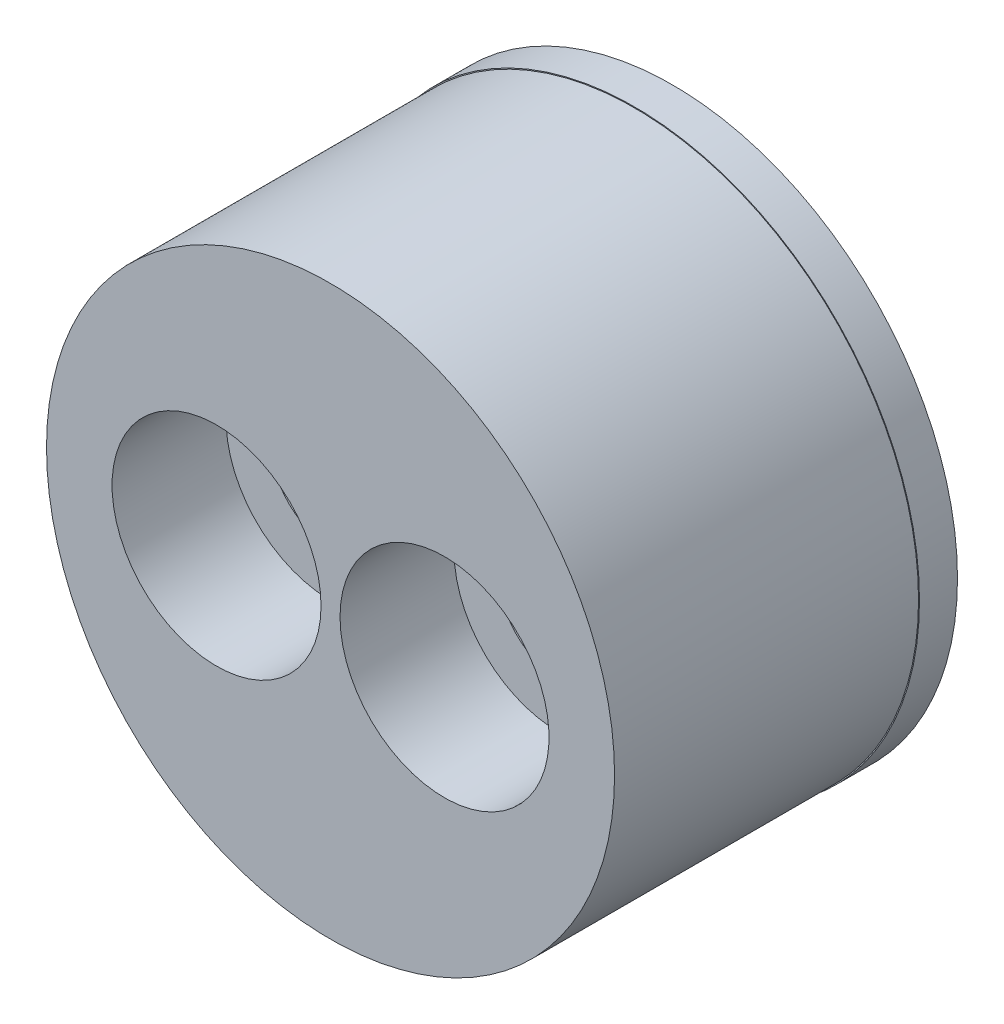
ISO-10303-21;
HEADER;
FILE_DESCRIPTION(('STEP AP214'),'2;1');
FILE_NAME('part.step','',(''),(''),'','','');
FILE_SCHEMA(('AUTOMOTIVE_DESIGN { 1 0 10303 214 1 1 1 1 }'));
ENDSEC;
DATA;
#1=APPLICATION_CONTEXT('core data for automotive mechanical design processes');
#2=APPLICATION_PROTOCOL_DEFINITION('international standard','automotive_design',2000,#1);
#3=PRODUCT_CONTEXT('',#1,'mechanical');
#4=PRODUCT('Part','Part','',(#3));
#5=PRODUCT_RELATED_PRODUCT_CATEGORY('part','',(#4));
#6=PRODUCT_DEFINITION_FORMATION('','',#4);
#7=PRODUCT_DEFINITION_CONTEXT('part definition',#1,'design');
#8=PRODUCT_DEFINITION('design','',#6,#7);
#9=PRODUCT_DEFINITION_SHAPE('','',#8);
#10=(LENGTH_UNIT() NAMED_UNIT(*) SI_UNIT(.MILLI.,.METRE.));
#11=(NAMED_UNIT(*) PLANE_ANGLE_UNIT() SI_UNIT($,.RADIAN.));
#12=(NAMED_UNIT(*) SI_UNIT($,.STERADIAN.) SOLID_ANGLE_UNIT());
#13=UNCERTAINTY_MEASURE_WITH_UNIT(LENGTH_MEASURE(1.E-05),#10,'distance_accuracy_value','');
#14=(GEOMETRIC_REPRESENTATION_CONTEXT(3) GLOBAL_UNCERTAINTY_ASSIGNED_CONTEXT((#13)) GLOBAL_UNIT_ASSIGNED_CONTEXT((#10,
#11,#12)) REPRESENTATION_CONTEXT('',''));
#15=CARTESIAN_POINT('',(0.,0.,0.));
#16=DIRECTION('',(0.,0.,1.));
#17=DIRECTION('',(1.,0.,0.));
#18=AXIS2_PLACEMENT_3D('',#15,#16,#17);
#19=CARTESIAN_POINT('',(-3.,0.,0.));
#20=DIRECTION('',(0.,0.,1.));
#21=DIRECTION('',(1.,0.,0.));
#22=AXIS2_PLACEMENT_3D('',#19,#20,#21);
#23=CYLINDRICAL_SURFACE('',#22,1.55);
#24=CARTESIAN_POINT('',(-3.,0.,0.));
#25=DIRECTION('',(0.,0.,1.));
#26=DIRECTION('',(1.,0.,0.));
#27=AXIS2_PLACEMENT_3D('',#24,#25,#26);
#28=CIRCLE('',#27,1.55);
#29=CARTESIAN_POINT('',(-1.45,0.,0.));
#30=VERTEX_POINT('',#29);
#31=EDGE_CURVE('E75',#30,#30,#28,.T.);
#32=ORIENTED_EDGE('',*,*,#31,.F.);
#33=EDGE_LOOP('',(#32));
#34=FACE_BOUND('',#33,.T.);
#35=CARTESIAN_POINT('',(-3.,0.,6.));
#36=DIRECTION('',(0.,0.,1.));
#37=DIRECTION('',(1.,0.,0.));
#38=AXIS2_PLACEMENT_3D('',#35,#36,#37);
#39=CIRCLE('',#38,1.55);
#40=CARTESIAN_POINT('',(-1.45,0.,6.));
#41=VERTEX_POINT('',#40);
#42=EDGE_CURVE('E54',#41,#41,#39,.F.);
#43=ORIENTED_EDGE('',*,*,#42,.F.);
#44=EDGE_LOOP('',(#43));
#45=FACE_BOUND('',#44,.T.);
#46=ADVANCED_FACE('F34',(#34,#45),#23,.F.);
#47=CARTESIAN_POINT('',(0.,0.,1.));
#48=DIRECTION('',(0.,0.,-1.));
#49=DIRECTION('',(-1.,0.,0.));
#50=AXIS2_PLACEMENT_3D('',#47,#48,#49);
#51=CYLINDRICAL_SURFACE('',#50,7.5);
#52=CARTESIAN_POINT('',(0.,0.,1.));
#53=DIRECTION('',(0.,0.,1.));
#54=DIRECTION('',(1.,0.,0.));
#55=AXIS2_PLACEMENT_3D('',#52,#53,#54);
#56=CIRCLE('',#55,7.5);
#57=CARTESIAN_POINT('',(7.5,0.,1.));
#58=VERTEX_POINT('',#57);
#59=EDGE_CURVE('E42',#58,#58,#56,.T.);
#60=ORIENTED_EDGE('',*,*,#59,.F.);
#61=EDGE_LOOP('',(#60));
#62=FACE_BOUND('',#61,.T.);
#63=CARTESIAN_POINT('',(0.,0.,0.));
#64=DIRECTION('',(0.,0.,1.));
#65=DIRECTION('',(1.,0.,0.));
#66=AXIS2_PLACEMENT_3D('',#63,#64,#65);
#67=CIRCLE('',#66,7.5);
#68=CARTESIAN_POINT('',(7.5,0.,0.));
#69=VERTEX_POINT('',#68);
#70=EDGE_CURVE('E47',#69,#69,#67,.T.);
#71=ORIENTED_EDGE('',*,*,#70,.T.);
#72=EDGE_LOOP('',(#71));
#73=FACE_BOUND('',#72,.T.);
#74=ADVANCED_FACE('F36',(#62,#73),#51,.T.);
#75=CARTESIAN_POINT('',(0.,0.,1.));
#76=DIRECTION('',(0.,0.,1.));
#77=DIRECTION('',(1.,0.,0.));
#78=AXIS2_PLACEMENT_3D('',#75,#76,#77);
#79=PLANE('',#78);
#80=CARTESIAN_POINT('',(0.,0.,1.));
#81=DIRECTION('',(0.,0.,1.));
#82=DIRECTION('',(1.,0.,0.));
#83=AXIS2_PLACEMENT_3D('',#80,#81,#82);
#84=CIRCLE('',#83,7.475);
#85=CARTESIAN_POINT('',(7.475,0.,1.));
#86=VERTEX_POINT('',#85);
#87=EDGE_CURVE('E10',#86,#86,#84,.T.);
#88=ORIENTED_EDGE('',*,*,#87,.F.);
#89=EDGE_LOOP('',(#88));
#90=FACE_BOUND('',#89,.T.);
#91=ORIENTED_EDGE('',*,*,#59,.T.);
#92=EDGE_LOOP('',(#91));
#93=FACE_BOUND('',#92,.T.);
#94=ADVANCED_FACE('F105',(#90,#93),#79,.T.);
#95=CARTESIAN_POINT('',(0.,0.,0.));
#96=DIRECTION('',(0.,0.,1.));
#97=DIRECTION('',(1.,0.,0.));
#98=AXIS2_PLACEMENT_3D('',#95,#96,#97);
#99=PLANE('',#98);
#100=ORIENTED_EDGE('',*,*,#31,.T.);
#101=EDGE_LOOP('',(#100));
#102=FACE_BOUND('',#101,.T.);
#103=CARTESIAN_POINT('',(3.,0.,0.));
#104=DIRECTION('',(0.,0.,1.));
#105=DIRECTION('',(-1.,0.,0.));
#106=AXIS2_PLACEMENT_3D('',#103,#104,#105);
#107=CIRCLE('',#106,1.55);
#108=CARTESIAN_POINT('',(1.45,0.,0.));
#109=VERTEX_POINT('',#108);
#110=EDGE_CURVE('E60',#109,#109,#107,.T.);
#111=ORIENTED_EDGE('',*,*,#110,.T.);
#112=EDGE_LOOP('',(#111));
#113=FACE_BOUND('',#112,.T.);
#114=ORIENTED_EDGE('',*,*,#70,.F.);
#115=EDGE_LOOP('',(#114));
#116=FACE_BOUND('',#115,.T.);
#117=ADVANCED_FACE('F80',(#102,#113,#116),#99,.F.);
#118=CARTESIAN_POINT('',(0.,0.,9.));
#119=DIRECTION('',(0.,0.,-1.));
#120=DIRECTION('',(-1.,0.,0.));
#121=AXIS2_PLACEMENT_3D('',#118,#119,#120);
#122=CYLINDRICAL_SURFACE('',#121,7.475);
#123=CARTESIAN_POINT('',(0.,0.,9.));
#124=DIRECTION('',(0.,0.,1.));
#125=DIRECTION('',(1.,0.,0.));
#126=AXIS2_PLACEMENT_3D('',#123,#124,#125);
#127=CIRCLE('',#126,7.475);
#128=CARTESIAN_POINT('',(7.475,0.,9.));
#129=VERTEX_POINT('',#128);
#130=EDGE_CURVE('E50',#129,#129,#127,.T.);
#131=ORIENTED_EDGE('',*,*,#130,.F.);
#132=EDGE_LOOP('',(#131));
#133=FACE_BOUND('',#132,.T.);
#134=ORIENTED_EDGE('',*,*,#87,.T.);
#135=EDGE_LOOP('',(#134));
#136=FACE_BOUND('',#135,.T.);
#137=ADVANCED_FACE('F95',(#133,#136),#122,.T.);
#138=CARTESIAN_POINT('',(0.,0.,9.));
#139=DIRECTION('',(0.,0.,1.));
#140=DIRECTION('',(1.,0.,0.));
#141=AXIS2_PLACEMENT_3D('',#138,#139,#140);
#142=PLANE('',#141);
#143=CARTESIAN_POINT('',(-3.,0.,9.));
#144=DIRECTION('',(0.,0.,1.));
#145=DIRECTION('',(1.,0.,0.));
#146=AXIS2_PLACEMENT_3D('',#143,#144,#145);
#147=CIRCLE('',#146,2.75);
#148=CARTESIAN_POINT('',(-0.25,0.,9.));
#149=VERTEX_POINT('',#148);
#150=EDGE_CURVE('E62',#149,#149,#147,.T.);
#151=ORIENTED_EDGE('',*,*,#150,.F.);
#152=EDGE_LOOP('',(#151));
#153=FACE_BOUND('',#152,.T.);
#154=CARTESIAN_POINT('',(3.,0.,9.));
#155=DIRECTION('',(0.,0.,1.));
#156=DIRECTION('',(-1.,0.,0.));
#157=AXIS2_PLACEMENT_3D('',#154,#155,#156);
#158=CIRCLE('',#157,2.75);
#159=CARTESIAN_POINT('',(0.25,0.,9.));
#160=VERTEX_POINT('',#159);
#161=EDGE_CURVE('E72',#160,#160,#158,.T.);
#162=ORIENTED_EDGE('',*,*,#161,.F.);
#163=EDGE_LOOP('',(#162));
#164=FACE_BOUND('',#163,.T.);
#165=ORIENTED_EDGE('',*,*,#130,.T.);
#166=EDGE_LOOP('',(#165));
#167=FACE_BOUND('',#166,.T.);
#168=ADVANCED_FACE('F86',(#153,#164,#167),#142,.T.);
#169=CARTESIAN_POINT('',(3.,0.,0.));
#170=DIRECTION('',(0.,0.,1.));
#171=DIRECTION('',(1.,0.,0.));
#172=AXIS2_PLACEMENT_3D('',#169,#170,#171);
#173=CYLINDRICAL_SURFACE('',#172,1.55);
#174=CARTESIAN_POINT('',(3.,0.,6.));
#175=DIRECTION('',(0.,0.,-1.));
#176=DIRECTION('',(-1.,0.,0.));
#177=AXIS2_PLACEMENT_3D('',#174,#175,#176);
#178=CIRCLE('',#177,1.55);
#179=CARTESIAN_POINT('',(1.45,0.,6.));
#180=VERTEX_POINT('',#179);
#181=EDGE_CURVE('E38',#180,#180,#178,.F.);
#182=ORIENTED_EDGE('',*,*,#181,.T.);
#183=EDGE_LOOP('',(#182));
#184=FACE_BOUND('',#183,.T.);
#185=ORIENTED_EDGE('',*,*,#110,.F.);
#186=EDGE_LOOP('',(#185));
#187=FACE_BOUND('',#186,.T.);
#188=ADVANCED_FACE('F83',(#184,#187),#173,.F.);
#189=CARTESIAN_POINT('',(-3.,0.,6.));
#190=DIRECTION('',(0.,0.,1.));
#191=DIRECTION('',(1.,0.,0.));
#192=AXIS2_PLACEMENT_3D('',#189,#190,#191);
#193=PLANE('',#192);
#194=CARTESIAN_POINT('',(-3.,0.,6.));
#195=DIRECTION('',(0.,0.,1.));
#196=DIRECTION('',(1.,0.,0.));
#197=AXIS2_PLACEMENT_3D('',#194,#195,#196);
#198=CIRCLE('',#197,2.75);
#199=CARTESIAN_POINT('',(-0.25,0.,6.));
#200=VERTEX_POINT('',#199);
#201=EDGE_CURVE('E56',#200,#200,#198,.T.);
#202=ORIENTED_EDGE('',*,*,#201,.T.);
#203=EDGE_LOOP('',(#202));
#204=FACE_BOUND('',#203,.T.);
#205=ORIENTED_EDGE('',*,*,#42,.T.);
#206=EDGE_LOOP('',(#205));
#207=FACE_BOUND('',#206,.T.);
#208=ADVANCED_FACE('F85',(#204,#207),#193,.T.);
#209=CARTESIAN_POINT('',(-3.,0.,6.));
#210=DIRECTION('',(0.,0.,1.));
#211=DIRECTION('',(1.,0.,0.));
#212=AXIS2_PLACEMENT_3D('',#209,#210,#211);
#213=CYLINDRICAL_SURFACE('',#212,2.75);
#214=ORIENTED_EDGE('',*,*,#201,.F.);
#215=EDGE_LOOP('',(#214));
#216=FACE_BOUND('',#215,.T.);
#217=ORIENTED_EDGE('',*,*,#150,.T.);
#218=EDGE_LOOP('',(#217));
#219=FACE_BOUND('',#218,.T.);
#220=ADVANCED_FACE('F93',(#216,#219),#213,.F.);
#221=CARTESIAN_POINT('',(3.,0.,6.));
#222=DIRECTION('',(0.,0.,-1.));
#223=DIRECTION('',(-1.,0.,0.));
#224=AXIS2_PLACEMENT_3D('',#221,#222,#223);
#225=PLANE('',#224);
#226=CARTESIAN_POINT('',(3.,0.,6.));
#227=DIRECTION('',(0.,0.,1.));
#228=DIRECTION('',(-1.,0.,0.));
#229=AXIS2_PLACEMENT_3D('',#226,#227,#228);
#230=CIRCLE('',#229,2.75);
#231=CARTESIAN_POINT('',(0.25,0.,6.));
#232=VERTEX_POINT('',#231);
#233=EDGE_CURVE('E67',#232,#232,#230,.T.);
#234=ORIENTED_EDGE('',*,*,#233,.T.);
#235=EDGE_LOOP('',(#234));
#236=FACE_BOUND('',#235,.T.);
#237=ORIENTED_EDGE('',*,*,#181,.F.);
#238=EDGE_LOOP('',(#237));
#239=FACE_BOUND('',#238,.T.);
#240=ADVANCED_FACE('F113',(#236,#239),#225,.F.);
#241=CARTESIAN_POINT('',(3.,0.,6.));
#242=DIRECTION('',(0.,0.,1.));
#243=DIRECTION('',(1.,0.,0.));
#244=AXIS2_PLACEMENT_3D('',#241,#242,#243);
#245=CYLINDRICAL_SURFACE('',#244,2.75);
#246=ORIENTED_EDGE('',*,*,#233,.F.);
#247=EDGE_LOOP('',(#246));
#248=FACE_BOUND('',#247,.T.);
#249=ORIENTED_EDGE('',*,*,#161,.T.);
#250=EDGE_LOOP('',(#249));
#251=FACE_BOUND('',#250,.T.);
#252=ADVANCED_FACE('F110',(#248,#251),#245,.F.);
#253=CLOSED_SHELL('',(#46,#74,#94,#117,#137,#168,#188,#208,#220,#240,#252));
#254=MANIFOLD_SOLID_BREP('B2',#253);
#255=ADVANCED_BREP_SHAPE_REPRESENTATION('',(#18,#254),#14);
#256=SHAPE_DEFINITION_REPRESENTATION(#9,#255);
ENDSEC;
END-ISO-10303-21;
